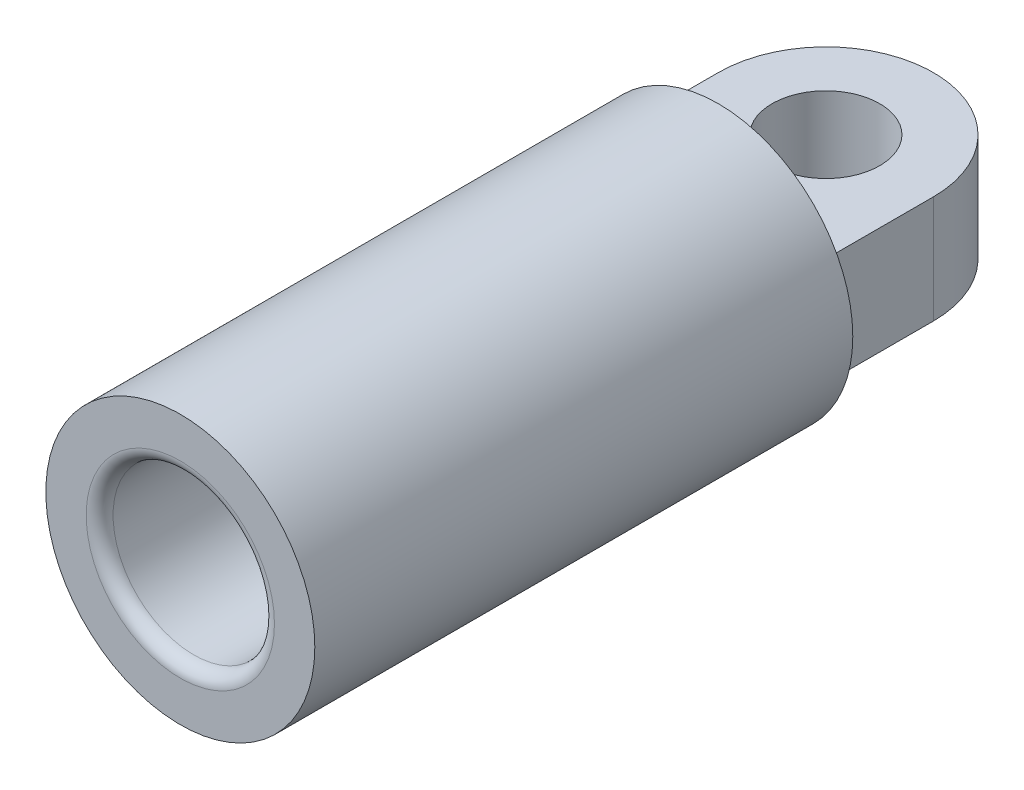
ISO-10303-21;
HEADER;
FILE_DESCRIPTION(('STEP AP214'),'2;1');
FILE_NAME('part.step','',(''),(''),'','','');
FILE_SCHEMA(('AUTOMOTIVE_DESIGN { 1 0 10303 214 1 1 1 1 }'));
ENDSEC;
DATA;
#1=APPLICATION_CONTEXT('core data for automotive mechanical design processes');
#2=APPLICATION_PROTOCOL_DEFINITION('international standard','automotive_design',2000,#1);
#3=PRODUCT_CONTEXT('',#1,'mechanical');
#4=PRODUCT('Part','Part','',(#3));
#5=PRODUCT_RELATED_PRODUCT_CATEGORY('part','',(#4));
#6=PRODUCT_DEFINITION_FORMATION('','',#4);
#7=PRODUCT_DEFINITION_CONTEXT('part definition',#1,'design');
#8=PRODUCT_DEFINITION('design','',#6,#7);
#9=PRODUCT_DEFINITION_SHAPE('','',#8);
#10=(LENGTH_UNIT() NAMED_UNIT(*) SI_UNIT(.MILLI.,.METRE.));
#11=(NAMED_UNIT(*) PLANE_ANGLE_UNIT() SI_UNIT($,.RADIAN.));
#12=(NAMED_UNIT(*) SI_UNIT($,.STERADIAN.) SOLID_ANGLE_UNIT());
#13=UNCERTAINTY_MEASURE_WITH_UNIT(LENGTH_MEASURE(1.E-05),#10,'distance_accuracy_value','');
#14=(GEOMETRIC_REPRESENTATION_CONTEXT(3) GLOBAL_UNCERTAINTY_ASSIGNED_CONTEXT((#13)) GLOBAL_UNIT_ASSIGNED_CONTEXT((#10,
#11,#12)) REPRESENTATION_CONTEXT('',''));
#15=CARTESIAN_POINT('',(0.,0.,0.));
#16=DIRECTION('',(0.,0.,1.));
#17=DIRECTION('',(1.,0.,0.));
#18=AXIS2_PLACEMENT_3D('',#15,#16,#17);
#19=CARTESIAN_POINT('',(0.,0.,-30.));
#20=DIRECTION('',(0.,0.,1.));
#21=DIRECTION('',(1.,0.,0.));
#22=AXIS2_PLACEMENT_3D('',#19,#20,#21);
#23=CYLINDRICAL_SURFACE('',#22,25.);
#24=CARTESIAN_POINT('',(0.,0.,-280.));
#25=DIRECTION('',(0.,0.,-1.));
#26=DIRECTION('',(-1.,0.,0.));
#27=AXIS2_PLACEMENT_3D('',#24,#25,#26);
#28=CIRCLE('',#27,25.);
#29=CARTESIAN_POINT('',(-25.,0.,-280.));
#30=VERTEX_POINT('',#29);
#31=EDGE_CURVE('E131',#30,#30,#28,.T.);
#32=ORIENTED_EDGE('',*,*,#31,.F.);
#33=EDGE_LOOP('',(#32));
#34=FACE_BOUND('',#33,.T.);
#35=CARTESIAN_POINT('',(0.,0.,-180.));
#36=DIRECTION('',(0.,0.,1.));
#37=DIRECTION('',(1.,0.,0.));
#38=AXIS2_PLACEMENT_3D('',#35,#36,#37);
#39=CIRCLE('',#38,25.);
#40=CARTESIAN_POINT('',(25.,0.,-180.));
#41=VERTEX_POINT('',#40);
#42=EDGE_CURVE('E150',#41,#41,#39,.T.);
#43=ORIENTED_EDGE('',*,*,#42,.F.);
#44=EDGE_LOOP('',(#43));
#45=FACE_BOUND('',#44,.T.);
#46=ADVANCED_FACE('F74',(#34,#45),#23,.T.);
#47=CARTESIAN_POINT('',(0.,10.,-320.));
#48=DIRECTION('',(0.,1.,0.));
#49=DIRECTION('',(0.,0.,1.));
#50=AXIS2_PLACEMENT_3D('',#47,#48,#49);
#51=PLANE('',#50);
#52=CARTESIAN_POINT('',(0.,10.,-300.));
#53=DIRECTION('',(0.,1.,0.));
#54=DIRECTION('',(0.,0.,1.));
#55=AXIS2_PLACEMENT_3D('',#52,#53,#54);
#56=CIRCLE('',#55,10.);
#57=CARTESIAN_POINT('',(0.,10.,-290.));
#58=VERTEX_POINT('',#57);
#59=EDGE_CURVE('E149',#58,#58,#56,.T.);
#60=ORIENTED_EDGE('',*,*,#59,.F.);
#61=EDGE_LOOP('',(#60));
#62=FACE_BOUND('',#61,.T.);
#63=DIRECTION('',(0.,0.,1.));
#64=VECTOR('',#63,1.);
#65=CARTESIAN_POINT('',(20.,10.,-320.));
#66=LINE('',#65,#64);
#67=CARTESIAN_POINT('',(20.,10.,-300.));
#68=VERTEX_POINT('',#67);
#69=CARTESIAN_POINT('',(20.,10.,-280.));
#70=VERTEX_POINT('',#69);
#71=EDGE_CURVE('E137',#68,#70,#66,.T.);
#72=ORIENTED_EDGE('',*,*,#71,.F.);
#73=CARTESIAN_POINT('',(0.,10.,-300.));
#74=DIRECTION('',(0.,1.,0.));
#75=DIRECTION('',(0.,0.,1.));
#76=AXIS2_PLACEMENT_3D('',#73,#74,#75);
#77=CIRCLE('',#76,20.);
#78=CARTESIAN_POINT('',(-20.,10.,-300.));
#79=VERTEX_POINT('',#78);
#80=EDGE_CURVE('E123',#68,#79,#77,.T.);
#81=ORIENTED_EDGE('',*,*,#80,.T.);
#82=DIRECTION('',(0.,0.,1.));
#83=VECTOR('',#82,1.);
#84=CARTESIAN_POINT('',(-20.,10.,-320.));
#85=LINE('',#84,#83);
#86=CARTESIAN_POINT('',(-20.,10.,-280.));
#87=VERTEX_POINT('',#86);
#88=EDGE_CURVE('E89',#79,#87,#85,.T.);
#89=ORIENTED_EDGE('',*,*,#88,.T.);
#90=DIRECTION('',(-1.,0.,0.));
#91=VECTOR('',#90,1.);
#92=CARTESIAN_POINT('',(0.,10.,-280.));
#93=LINE('',#92,#91);
#94=EDGE_CURVE('E289',#70,#87,#93,.T.);
#95=ORIENTED_EDGE('',*,*,#94,.F.);
#96=EDGE_LOOP('',(#72,#81,#89,#95));
#97=FACE_BOUND('',#96,.T.);
#98=ADVANCED_FACE('F167',(#62,#97),#51,.T.);
#99=CARTESIAN_POINT('',(0.,-10.,-320.));
#100=DIRECTION('',(0.,1.,0.));
#101=DIRECTION('',(0.,0.,1.));
#102=AXIS2_PLACEMENT_3D('',#99,#100,#101);
#103=PLANE('',#102);
#104=CARTESIAN_POINT('',(0.,-10.,-300.));
#105=DIRECTION('',(0.,1.,0.));
#106=DIRECTION('',(0.,0.,1.));
#107=AXIS2_PLACEMENT_3D('',#104,#105,#106);
#108=CIRCLE('',#107,10.);
#109=CARTESIAN_POINT('',(0.,-10.,-290.));
#110=VERTEX_POINT('',#109);
#111=EDGE_CURVE('E147',#110,#110,#108,.T.);
#112=ORIENTED_EDGE('',*,*,#111,.T.);
#113=EDGE_LOOP('',(#112));
#114=FACE_BOUND('',#113,.T.);
#115=CARTESIAN_POINT('',(0.,-10.,-300.));
#116=DIRECTION('',(0.,1.,0.));
#117=DIRECTION('',(0.,0.,1.));
#118=AXIS2_PLACEMENT_3D('',#115,#116,#117);
#119=CIRCLE('',#118,20.);
#120=CARTESIAN_POINT('',(20.,-10.,-300.));
#121=VERTEX_POINT('',#120);
#122=CARTESIAN_POINT('',(-20.,-10.,-300.));
#123=VERTEX_POINT('',#122);
#124=EDGE_CURVE('E116',#121,#123,#119,.T.);
#125=ORIENTED_EDGE('',*,*,#124,.F.);
#126=DIRECTION('',(0.,0.,1.));
#127=VECTOR('',#126,1.);
#128=CARTESIAN_POINT('',(20.,-10.,-320.));
#129=LINE('',#128,#127);
#130=CARTESIAN_POINT('',(20.,-10.,-280.));
#131=VERTEX_POINT('',#130);
#132=EDGE_CURVE('E120',#121,#131,#129,.T.);
#133=ORIENTED_EDGE('',*,*,#132,.T.);
#134=DIRECTION('',(-1.,0.,0.));
#135=VECTOR('',#134,1.);
#136=CARTESIAN_POINT('',(0.,-10.,-280.));
#137=LINE('',#136,#135);
#138=CARTESIAN_POINT('',(-20.,-10.,-280.));
#139=VERTEX_POINT('',#138);
#140=EDGE_CURVE('E140',#131,#139,#137,.T.);
#141=ORIENTED_EDGE('',*,*,#140,.T.);
#142=DIRECTION('',(0.,0.,1.));
#143=VECTOR('',#142,1.);
#144=CARTESIAN_POINT('',(-20.,-10.,-320.));
#145=LINE('',#144,#143);
#146=EDGE_CURVE('E96',#123,#139,#145,.T.);
#147=ORIENTED_EDGE('',*,*,#146,.F.);
#148=EDGE_LOOP('',(#125,#133,#141,#147));
#149=FACE_BOUND('',#148,.T.);
#150=ADVANCED_FACE('F118',(#114,#149),#103,.F.);
#151=CARTESIAN_POINT('',(0.,0.,-280.));
#152=DIRECTION('',(0.,0.,-1.));
#153=DIRECTION('',(-1.,0.,0.));
#154=AXIS2_PLACEMENT_3D('',#151,#152,#153);
#155=PLANE('',#154);
#156=ORIENTED_EDGE('',*,*,#31,.T.);
#157=EDGE_LOOP('',(#156));
#158=FACE_BOUND('',#157,.T.);
#159=ORIENTED_EDGE('',*,*,#94,.T.);
#160=DIRECTION('',(0.,-1.,0.));
#161=VECTOR('',#160,1.);
#162=CARTESIAN_POINT('',(-20.,0.,-280.));
#163=LINE('',#162,#161);
#164=EDGE_CURVE('E286',#87,#139,#163,.T.);
#165=ORIENTED_EDGE('',*,*,#164,.T.);
#166=ORIENTED_EDGE('',*,*,#140,.F.);
#167=DIRECTION('',(0.,-1.,0.));
#168=VECTOR('',#167,1.);
#169=CARTESIAN_POINT('',(20.,0.,-280.));
#170=LINE('',#169,#168);
#171=EDGE_CURVE('E135',#70,#131,#170,.T.);
#172=ORIENTED_EDGE('',*,*,#171,.F.);
#173=EDGE_LOOP('',(#159,#165,#166,#172));
#174=FACE_BOUND('',#173,.T.);
#175=ADVANCED_FACE('F177',(#158,#174),#155,.T.);
#176=CARTESIAN_POINT('',(-20.,0.,-320.));
#177=DIRECTION('',(-1.,0.,0.));
#178=DIRECTION('',(0.,0.,1.));
#179=AXIS2_PLACEMENT_3D('',#176,#177,#178);
#180=PLANE('',#179);
#181=DIRECTION('',(0.,1.,0.));
#182=VECTOR('',#181,1.);
#183=CARTESIAN_POINT('',(-20.,-25.,-300.));
#184=LINE('',#183,#182);
#185=EDGE_CURVE('E124',#123,#79,#184,.T.);
#186=ORIENTED_EDGE('',*,*,#185,.F.);
#187=ORIENTED_EDGE('',*,*,#146,.T.);
#188=ORIENTED_EDGE('',*,*,#164,.F.);
#189=ORIENTED_EDGE('',*,*,#88,.F.);
#190=EDGE_LOOP('',(#186,#187,#188,#189));
#191=FACE_BOUND('',#190,.T.);
#192=ADVANCED_FACE('F180',(#191),#180,.T.);
#193=CARTESIAN_POINT('',(20.,0.,-320.));
#194=DIRECTION('',(-1.,0.,0.));
#195=DIRECTION('',(0.,0.,1.));
#196=AXIS2_PLACEMENT_3D('',#193,#194,#195);
#197=PLANE('',#196);
#198=ORIENTED_EDGE('',*,*,#132,.F.);
#199=DIRECTION('',(0.,1.,0.));
#200=VECTOR('',#199,1.);
#201=CARTESIAN_POINT('',(20.,-25.,-300.));
#202=LINE('',#201,#200);
#203=EDGE_CURVE('E127',#121,#68,#202,.T.);
#204=ORIENTED_EDGE('',*,*,#203,.T.);
#205=ORIENTED_EDGE('',*,*,#71,.T.);
#206=ORIENTED_EDGE('',*,*,#171,.T.);
#207=EDGE_LOOP('',(#198,#204,#205,#206));
#208=FACE_BOUND('',#207,.T.);
#209=ADVANCED_FACE('F133',(#208),#197,.F.);
#210=CARTESIAN_POINT('',(0.,-25.,-300.));
#211=DIRECTION('',(0.,1.,0.));
#212=DIRECTION('',(0.,0.,1.));
#213=AXIS2_PLACEMENT_3D('',#210,#211,#212);
#214=CYLINDRICAL_SURFACE('',#213,20.);
#215=ORIENTED_EDGE('',*,*,#80,.F.);
#216=ORIENTED_EDGE('',*,*,#203,.F.);
#217=ORIENTED_EDGE('',*,*,#124,.T.);
#218=ORIENTED_EDGE('',*,*,#185,.T.);
#219=EDGE_LOOP('',(#215,#216,#217,#218));
#220=FACE_BOUND('',#219,.T.);
#221=ADVANCED_FACE('F128',(#220),#214,.T.);
#222=CARTESIAN_POINT('',(0.,-25.,-300.));
#223=DIRECTION('',(0.,1.,0.));
#224=DIRECTION('',(0.,0.,1.));
#225=AXIS2_PLACEMENT_3D('',#222,#223,#224);
#226=CYLINDRICAL_SURFACE('',#225,10.);
#227=ORIENTED_EDGE('',*,*,#59,.T.);
#228=EDGE_LOOP('',(#227));
#229=FACE_BOUND('',#228,.T.);
#230=ORIENTED_EDGE('',*,*,#111,.F.);
#231=EDGE_LOOP('',(#230));
#232=FACE_BOUND('',#231,.T.);
#233=ADVANCED_FACE('F191',(#229,#232),#226,.F.);
#234=CARTESIAN_POINT('',(0.,0.,-180.));
#235=DIRECTION('',(0.,0.,1.));
#236=DIRECTION('',(1.,0.,0.));
#237=AXIS2_PLACEMENT_3D('',#234,#235,#236);
#238=PLANE('',#237);
#239=CARTESIAN_POINT('',(0.,0.,-180.));
#240=DIRECTION('',(0.,0.,1.));
#241=DIRECTION('',(1.,0.,0.));
#242=AXIS2_PLACEMENT_3D('',#239,#240,#241);
#243=CIRCLE('',#242,17.5);
#244=CARTESIAN_POINT('',(17.5,0.,-180.));
#245=VERTEX_POINT('',#244);
#246=EDGE_CURVE('E12',#245,#245,#243,.F.);
#247=ORIENTED_EDGE('',*,*,#246,.T.);
#248=EDGE_LOOP('',(#247));
#249=FACE_BOUND('',#248,.T.);
#250=ORIENTED_EDGE('',*,*,#42,.T.);
#251=EDGE_LOOP('',(#250));
#252=FACE_BOUND('',#251,.T.);
#253=ADVANCED_FACE('F194',(#249,#252),#238,.T.);
#254=CARTESIAN_POINT('',(0.,0.,-210.));
#255=DIRECTION('',(0.,0.,1.));
#256=DIRECTION('',(1.,0.,0.));
#257=AXIS2_PLACEMENT_3D('',#254,#255,#256);
#258=CYLINDRICAL_SURFACE('',#257,15.);
#259=CARTESIAN_POINT('',(0.,0.,-182.5));
#260=DIRECTION('',(0.,0.,1.));
#261=DIRECTION('',(1.,0.,0.));
#262=AXIS2_PLACEMENT_3D('',#259,#260,#261);
#263=CIRCLE('',#262,15.);
#264=CARTESIAN_POINT('',(15.,0.,-182.5));
#265=VERTEX_POINT('',#264);
#266=EDGE_CURVE('E82',#265,#265,#263,.T.);
#267=ORIENTED_EDGE('',*,*,#266,.T.);
#268=EDGE_LOOP('',(#267));
#269=FACE_BOUND('',#268,.T.);
#270=CARTESIAN_POINT('',(0.,0.,-210.));
#271=DIRECTION('',(0.,0.,1.));
#272=DIRECTION('',(1.,0.,0.));
#273=AXIS2_PLACEMENT_3D('',#270,#271,#272);
#274=CIRCLE('',#273,15.);
#275=CARTESIAN_POINT('',(15.,0.,-210.));
#276=VERTEX_POINT('',#275);
#277=EDGE_CURVE('E277',#276,#276,#274,.T.);
#278=ORIENTED_EDGE('',*,*,#277,.F.);
#279=EDGE_LOOP('',(#278));
#280=FACE_BOUND('',#279,.T.);
#281=ADVANCED_FACE('F154',(#269,#280),#258,.F.);
#282=CARTESIAN_POINT('',(0.,0.,-210.));
#283=DIRECTION('',(0.,0.,1.));
#284=DIRECTION('',(1.,0.,0.));
#285=AXIS2_PLACEMENT_3D('',#282,#283,#284);
#286=PLANE('',#285);
#287=ORIENTED_EDGE('',*,*,#277,.T.);
#288=EDGE_LOOP('',(#287));
#289=FACE_BOUND('',#288,.T.);
#290=ADVANCED_FACE('F158',(#289),#286,.T.);
#291=CARTESIAN_POINT('',(0.,0.,-182.5));
#292=DIRECTION('',(0.,0.,1.));
#293=DIRECTION('',(1.,0.,0.));
#294=AXIS2_PLACEMENT_3D('',#291,#292,#293);
#295=TOROIDAL_SURFACE('',#294,17.5,2.5);
#296=ORIENTED_EDGE('',*,*,#246,.F.);
#297=EDGE_LOOP('',(#296));
#298=FACE_BOUND('',#297,.T.);
#299=ORIENTED_EDGE('',*,*,#266,.F.);
#300=EDGE_LOOP('',(#299));
#301=FACE_BOUND('',#300,.T.);
#302=ADVANCED_FACE('F76',(#298,#301),#295,.T.);
#303=CLOSED_SHELL('',(#46,#98,#150,#175,#192,#209,#221,#233,#253,#281,#290,#302));
#304=MANIFOLD_SOLID_BREP('B2',#303);
#305=ADVANCED_BREP_SHAPE_REPRESENTATION('',(#18,#304),#14);
#306=SHAPE_DEFINITION_REPRESENTATION(#9,#305);
ENDSEC;
END-ISO-10303-21;
